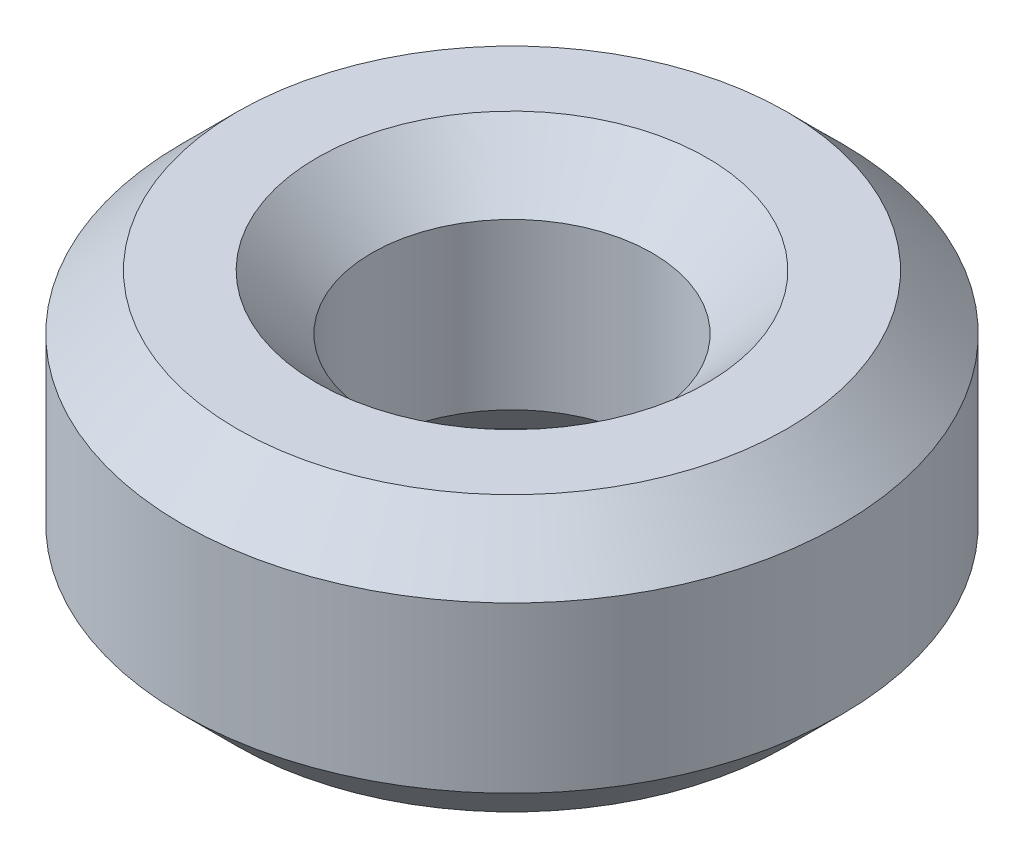
ISO-10303-21;
HEADER;
FILE_DESCRIPTION(('STEP AP214'),'2;1');
FILE_NAME('part.step','',(''),(''),'','','');
FILE_SCHEMA(('AUTOMOTIVE_DESIGN { 1 0 10303 214 1 1 1 1 }'));
ENDSEC;
DATA;
#1=APPLICATION_CONTEXT('core data for automotive mechanical design processes');
#2=APPLICATION_PROTOCOL_DEFINITION('international standard','automotive_design',2000,#1);
#3=PRODUCT_CONTEXT('',#1,'mechanical');
#4=PRODUCT('Part','Part','',(#3));
#5=PRODUCT_RELATED_PRODUCT_CATEGORY('part','',(#4));
#6=PRODUCT_DEFINITION_FORMATION('','',#4);
#7=PRODUCT_DEFINITION_CONTEXT('part definition',#1,'design');
#8=PRODUCT_DEFINITION('design','',#6,#7);
#9=PRODUCT_DEFINITION_SHAPE('','',#8);
#10=(LENGTH_UNIT() NAMED_UNIT(*) SI_UNIT(.MILLI.,.METRE.));
#11=(NAMED_UNIT(*) PLANE_ANGLE_UNIT() SI_UNIT($,.RADIAN.));
#12=(NAMED_UNIT(*) SI_UNIT($,.STERADIAN.) SOLID_ANGLE_UNIT());
#13=UNCERTAINTY_MEASURE_WITH_UNIT(LENGTH_MEASURE(1.E-05),#10,'distance_accuracy_value','');
#14=(GEOMETRIC_REPRESENTATION_CONTEXT(3) GLOBAL_UNCERTAINTY_ASSIGNED_CONTEXT((#13)) GLOBAL_UNIT_ASSIGNED_CONTEXT((#10,
#11,#12)) REPRESENTATION_CONTEXT('',''));
#15=CARTESIAN_POINT('',(0.,0.,0.));
#16=DIRECTION('',(0.,0.,1.));
#17=DIRECTION('',(1.,0.,0.));
#18=AXIS2_PLACEMENT_3D('',#15,#16,#17);
#19=CARTESIAN_POINT('',(0.,5.,0.));
#20=DIRECTION('',(0.,-1.,0.));
#21=DIRECTION('',(0.,0.,-1.));
#22=AXIS2_PLACEMENT_3D('',#19,#20,#21);
#23=CYLINDRICAL_SURFACE('',#22,2.55);
#24=CARTESIAN_POINT('',(0.,1.,0.));
#25=DIRECTION('',(0.,1.,0.));
#26=DIRECTION('',(0.,0.,1.));
#27=AXIS2_PLACEMENT_3D('',#24,#25,#26);
#28=CIRCLE('',#27,2.55);
#29=CARTESIAN_POINT('',(0.,1.,2.55));
#30=VERTEX_POINT('',#29);
#31=EDGE_CURVE('E57',#30,#30,#28,.F.);
#32=ORIENTED_EDGE('',*,*,#31,.T.);
#33=EDGE_LOOP('',(#32));
#34=FACE_BOUND('',#33,.T.);
#35=CARTESIAN_POINT('',(0.,4.,0.));
#36=DIRECTION('',(0.,1.,0.));
#37=DIRECTION('',(0.,0.,1.));
#38=AXIS2_PLACEMENT_3D('',#35,#36,#37);
#39=CIRCLE('',#38,2.55);
#40=CARTESIAN_POINT('',(0.,4.,2.55));
#41=VERTEX_POINT('',#40);
#42=EDGE_CURVE('E62',#41,#41,#39,.T.);
#43=ORIENTED_EDGE('',*,*,#42,.T.);
#44=EDGE_LOOP('',(#43));
#45=FACE_BOUND('',#44,.T.);
#46=ADVANCED_FACE('F43',(#34,#45),#23,.F.);
#47=CARTESIAN_POINT('',(0.,5.,0.));
#48=DIRECTION('',(0.,-1.,0.));
#49=DIRECTION('',(0.,0.,-1.));
#50=AXIS2_PLACEMENT_3D('',#47,#48,#49);
#51=CYLINDRICAL_SURFACE('',#50,6.);
#52=CARTESIAN_POINT('',(0.,0.999999999999998,0.));
#53=DIRECTION('',(0.,1.,0.));
#54=DIRECTION('',(0.,0.,1.));
#55=AXIS2_PLACEMENT_3D('',#52,#53,#54);
#56=CIRCLE('',#55,6.);
#57=CARTESIAN_POINT('',(0.,0.999999999999998,6.));
#58=VERTEX_POINT('',#57);
#59=EDGE_CURVE('E76',#58,#58,#56,.T.);
#60=ORIENTED_EDGE('',*,*,#59,.T.);
#61=EDGE_LOOP('',(#60));
#62=FACE_BOUND('',#61,.T.);
#63=CARTESIAN_POINT('',(0.,4.,0.));
#64=DIRECTION('',(0.,1.,0.));
#65=DIRECTION('',(0.,0.,1.));
#66=AXIS2_PLACEMENT_3D('',#63,#64,#65);
#67=CIRCLE('',#66,6.);
#68=CARTESIAN_POINT('',(0.,4.,6.));
#69=VERTEX_POINT('',#68);
#70=EDGE_CURVE('E80',#69,#69,#67,.F.);
#71=ORIENTED_EDGE('',*,*,#70,.T.);
#72=EDGE_LOOP('',(#71));
#73=FACE_BOUND('',#72,.T.);
#74=ADVANCED_FACE('F85',(#62,#73),#51,.T.);
#75=CARTESIAN_POINT('',(0.,5.,0.));
#76=DIRECTION('',(0.,1.,0.));
#77=DIRECTION('',(0.,0.,1.));
#78=AXIS2_PLACEMENT_3D('',#75,#76,#77);
#79=PLANE('',#78);
#80=CARTESIAN_POINT('',(0.,5.,0.));
#81=DIRECTION('',(0.,1.,0.));
#82=DIRECTION('',(0.,0.,1.));
#83=AXIS2_PLACEMENT_3D('',#80,#81,#82);
#84=CIRCLE('',#83,5.);
#85=CARTESIAN_POINT('',(0.,5.,5.));
#86=VERTEX_POINT('',#85);
#87=EDGE_CURVE('E10',#86,#86,#84,.T.);
#88=ORIENTED_EDGE('',*,*,#87,.T.);
#89=EDGE_LOOP('',(#88));
#90=FACE_BOUND('',#89,.T.);
#91=CARTESIAN_POINT('',(0.,5.,0.));
#92=DIRECTION('',(0.,1.,0.));
#93=DIRECTION('',(0.,0.,1.));
#94=AXIS2_PLACEMENT_3D('',#91,#92,#93);
#95=CIRCLE('',#94,3.55000000000001);
#96=CARTESIAN_POINT('',(0.,5.,3.55000000000001));
#97=VERTEX_POINT('',#96);
#98=EDGE_CURVE('E52',#97,#97,#95,.F.);
#99=ORIENTED_EDGE('',*,*,#98,.T.);
#100=EDGE_LOOP('',(#99));
#101=FACE_BOUND('',#100,.T.);
#102=ADVANCED_FACE('F106',(#90,#101),#79,.T.);
#103=CARTESIAN_POINT('',(0.,0.,0.));
#104=DIRECTION('',(0.,1.,0.));
#105=DIRECTION('',(0.,0.,1.));
#106=AXIS2_PLACEMENT_3D('',#103,#104,#105);
#107=PLANE('',#106);
#108=CARTESIAN_POINT('',(0.,0.,0.));
#109=DIRECTION('',(0.,1.,0.));
#110=DIRECTION('',(0.,0.,1.));
#111=AXIS2_PLACEMENT_3D('',#108,#109,#110);
#112=CIRCLE('',#111,5.);
#113=CARTESIAN_POINT('',(0.,0.,5.));
#114=VERTEX_POINT('',#113);
#115=EDGE_CURVE('E68',#114,#114,#112,.F.);
#116=ORIENTED_EDGE('',*,*,#115,.T.);
#117=EDGE_LOOP('',(#116));
#118=FACE_BOUND('',#117,.T.);
#119=CARTESIAN_POINT('',(0.,0.,0.));
#120=DIRECTION('',(0.,1.,0.));
#121=DIRECTION('',(0.,0.,1.));
#122=AXIS2_PLACEMENT_3D('',#119,#120,#121);
#123=CIRCLE('',#122,3.55);
#124=CARTESIAN_POINT('',(0.,0.,3.55));
#125=VERTEX_POINT('',#124);
#126=EDGE_CURVE('E72',#125,#125,#123,.T.);
#127=ORIENTED_EDGE('',*,*,#126,.T.);
#128=EDGE_LOOP('',(#127));
#129=FACE_BOUND('',#128,.T.);
#130=ADVANCED_FACE('F117',(#118,#129),#107,.F.);
#131=CARTESIAN_POINT('',(0.,0.999999999999998,0.));
#132=DIRECTION('',(0.,1.,0.));
#133=DIRECTION('',(0.,0.,1.));
#134=AXIS2_PLACEMENT_3D('',#131,#132,#133);
#135=CONICAL_SURFACE('',#134,6.,0.78539816339745);
#136=ORIENTED_EDGE('',*,*,#115,.F.);
#137=EDGE_LOOP('',(#136));
#138=FACE_BOUND('',#137,.T.);
#139=ORIENTED_EDGE('',*,*,#59,.F.);
#140=EDGE_LOOP('',(#139));
#141=FACE_BOUND('',#140,.T.);
#142=ADVANCED_FACE('F96',(#138,#141),#135,.T.);
#143=CARTESIAN_POINT('',(0.,0.,0.));
#144=DIRECTION('',(0.,-1.,0.));
#145=DIRECTION('',(0.,0.,-1.));
#146=AXIS2_PLACEMENT_3D('',#143,#144,#145);
#147=CONICAL_SURFACE('',#146,3.55,0.785398163397447);
#148=ORIENTED_EDGE('',*,*,#31,.F.);
#149=EDGE_LOOP('',(#148));
#150=FACE_BOUND('',#149,.T.);
#151=ORIENTED_EDGE('',*,*,#126,.F.);
#152=EDGE_LOOP('',(#151));
#153=FACE_BOUND('',#152,.T.);
#154=ADVANCED_FACE('F90',(#150,#153),#147,.F.);
#155=CARTESIAN_POINT('',(0.,5.,0.));
#156=DIRECTION('',(0.,-1.,0.));
#157=DIRECTION('',(0.,0.,-1.));
#158=AXIS2_PLACEMENT_3D('',#155,#156,#157);
#159=CONICAL_SURFACE('',#158,5.,0.785398163397446);
#160=ORIENTED_EDGE('',*,*,#70,.F.);
#161=EDGE_LOOP('',(#160));
#162=FACE_BOUND('',#161,.T.);
#163=ORIENTED_EDGE('',*,*,#87,.F.);
#164=EDGE_LOOP('',(#163));
#165=FACE_BOUND('',#164,.T.);
#166=ADVANCED_FACE('F87',(#162,#165),#159,.T.);
#167=CARTESIAN_POINT('',(0.,4.,0.));
#168=DIRECTION('',(0.,1.,0.));
#169=DIRECTION('',(0.,0.,1.));
#170=AXIS2_PLACEMENT_3D('',#167,#168,#169);
#171=CONICAL_SURFACE('',#170,2.55,0.78539816339745);
#172=ORIENTED_EDGE('',*,*,#98,.F.);
#173=EDGE_LOOP('',(#172));
#174=FACE_BOUND('',#173,.T.);
#175=ORIENTED_EDGE('',*,*,#42,.F.);
#176=EDGE_LOOP('',(#175));
#177=FACE_BOUND('',#176,.T.);
#178=ADVANCED_FACE('F46',(#174,#177),#171,.F.);
#179=CLOSED_SHELL('',(#46,#74,#102,#130,#142,#154,#166,#178));
#180=MANIFOLD_SOLID_BREP('B2',#179);
#181=ADVANCED_BREP_SHAPE_REPRESENTATION('',(#18,#180),#14);
#182=SHAPE_DEFINITION_REPRESENTATION(#9,#181);
ENDSEC;
END-ISO-10303-21;
